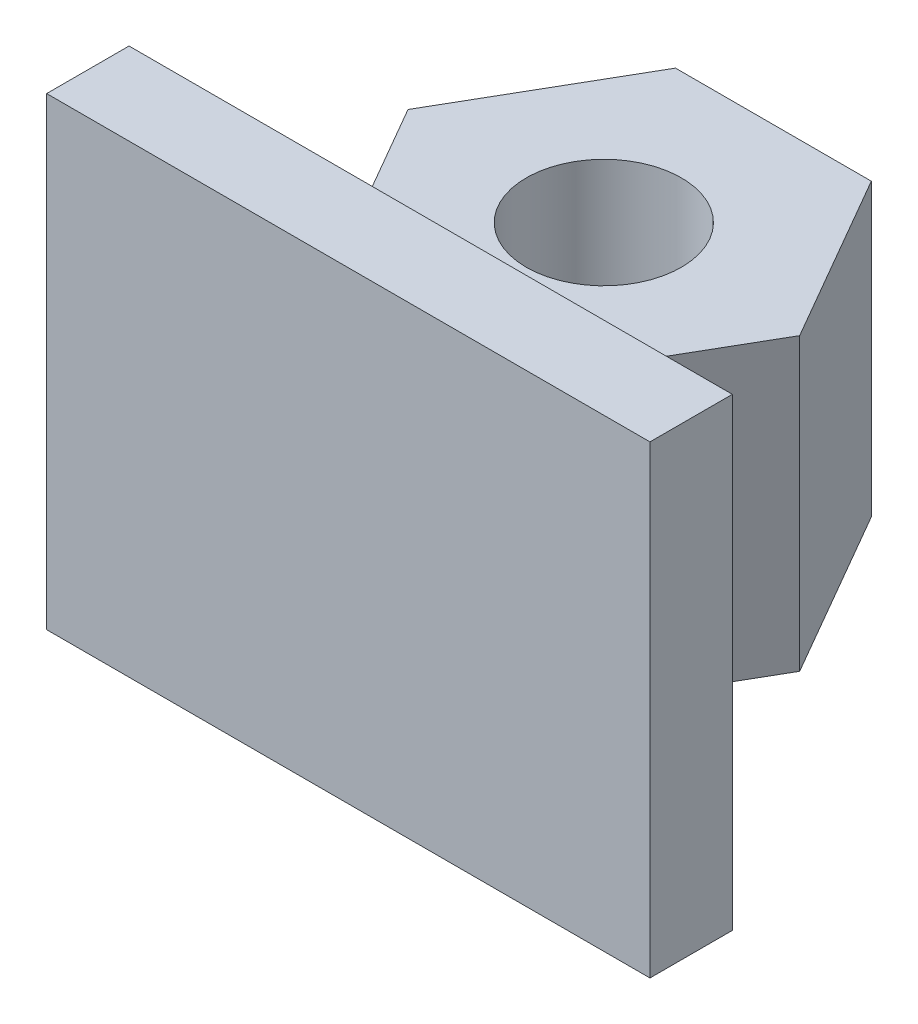
ISO-10303-21;
HEADER;
FILE_DESCRIPTION(('STEP AP214'),'2;1');
FILE_NAME('part.step','',(''),(''),'','','');
FILE_SCHEMA(('AUTOMOTIVE_DESIGN { 1 0 10303 214 1 1 1 1 }'));
ENDSEC;
DATA;
#1=APPLICATION_CONTEXT('core data for automotive mechanical design processes');
#2=APPLICATION_PROTOCOL_DEFINITION('international standard','automotive_design',2000,#1);
#3=PRODUCT_CONTEXT('',#1,'mechanical');
#4=PRODUCT('Part','Part','',(#3));
#5=PRODUCT_RELATED_PRODUCT_CATEGORY('part','',(#4));
#6=PRODUCT_DEFINITION_FORMATION('','',#4);
#7=PRODUCT_DEFINITION_CONTEXT('part definition',#1,'design');
#8=PRODUCT_DEFINITION('design','',#6,#7);
#9=PRODUCT_DEFINITION_SHAPE('','',#8);
#10=(LENGTH_UNIT() NAMED_UNIT(*) SI_UNIT(.MILLI.,.METRE.));
#11=(NAMED_UNIT(*) PLANE_ANGLE_UNIT() SI_UNIT($,.RADIAN.));
#12=(NAMED_UNIT(*) SI_UNIT($,.STERADIAN.) SOLID_ANGLE_UNIT());
#13=UNCERTAINTY_MEASURE_WITH_UNIT(LENGTH_MEASURE(1.E-05),#10,'distance_accuracy_value','');
#14=(GEOMETRIC_REPRESENTATION_CONTEXT(3) GLOBAL_UNCERTAINTY_ASSIGNED_CONTEXT((#13)) GLOBAL_UNIT_ASSIGNED_CONTEXT((#10,
#11,#12)) REPRESENTATION_CONTEXT('',''));
#15=CARTESIAN_POINT('',(0.,0.,0.));
#16=DIRECTION('',(0.,0.,1.));
#17=DIRECTION('',(1.,0.,0.));
#18=AXIS2_PLACEMENT_3D('',#15,#16,#17);
#19=CARTESIAN_POINT('',(0.,30.,0.));
#20=DIRECTION('',(0.,1.,0.));
#21=DIRECTION('',(0.,0.,1.));
#22=AXIS2_PLACEMENT_3D('',#19,#20,#21);
#23=PLANE('',#22);
#24=DIRECTION('',(0.5,0.,-0.866025403784439));
#25=VECTOR('',#24,1.);
#26=CARTESIAN_POINT('',(10.1036297108185,30.,17.5));
#27=LINE('',#26,#25);
#28=CARTESIAN_POINT('',(10.1036297108185,30.,17.5));
#29=VERTEX_POINT('',#28);
#30=CARTESIAN_POINT('',(20.2072594216369,30.,0.));
#31=VERTEX_POINT('',#30);
#32=EDGE_CURVE('E131',#29,#31,#27,.T.);
#33=ORIENTED_EDGE('',*,*,#32,.T.);
#34=DIRECTION('',(-0.5,0.,-0.866025403784439));
#35=VECTOR('',#34,1.);
#36=CARTESIAN_POINT('',(20.2072594216369,30.,0.));
#37=LINE('',#36,#35);
#38=CARTESIAN_POINT('',(10.1036297108184,30.,-17.5));
#39=VERTEX_POINT('',#38);
#40=EDGE_CURVE('E86',#31,#39,#37,.T.);
#41=ORIENTED_EDGE('',*,*,#40,.T.);
#42=DIRECTION('',(-1.,0.,0.));
#43=VECTOR('',#42,1.);
#44=CARTESIAN_POINT('',(10.1036297108184,30.,-17.5));
#45=LINE('',#44,#43);
#46=CARTESIAN_POINT('',(-10.1036297108185,30.,-17.5));
#47=VERTEX_POINT('',#46);
#48=EDGE_CURVE('E101',#39,#47,#45,.T.);
#49=ORIENTED_EDGE('',*,*,#48,.T.);
#50=DIRECTION('',(-0.5,0.,0.866025403784439));
#51=VECTOR('',#50,1.);
#52=CARTESIAN_POINT('',(-10.1036297108185,30.,-17.5));
#53=LINE('',#52,#51);
#54=CARTESIAN_POINT('',(-20.2072594216369,30.,0.));
#55=VERTEX_POINT('',#54);
#56=EDGE_CURVE('E95',#47,#55,#53,.T.);
#57=ORIENTED_EDGE('',*,*,#56,.T.);
#58=DIRECTION('',(0.5,0.,0.866025403784438));
#59=VECTOR('',#58,1.);
#60=CARTESIAN_POINT('',(-20.2072594216369,30.,0.));
#61=LINE('',#60,#59);
#62=CARTESIAN_POINT('',(-10.1036297108185,30.,17.5));
#63=VERTEX_POINT('',#62);
#64=EDGE_CURVE('E98',#55,#63,#61,.T.);
#65=ORIENTED_EDGE('',*,*,#64,.T.);
#66=DIRECTION('',(1.,0.,0.));
#67=VECTOR('',#66,1.);
#68=CARTESIAN_POINT('',(-10.1036297108185,30.,17.5));
#69=LINE('',#68,#67);
#70=EDGE_CURVE('E50',#63,#29,#69,.T.);
#71=ORIENTED_EDGE('',*,*,#70,.T.);
#72=EDGE_LOOP('',(#33,#41,#49,#57,#65,#71));
#73=FACE_BOUND('',#72,.T.);
#74=CARTESIAN_POINT('',(0.,30.,0.));
#75=DIRECTION('',(0.,1.,0.));
#76=DIRECTION('',(0.,0.,1.));
#77=AXIS2_PLACEMENT_3D('',#74,#75,#76);
#78=CIRCLE('',#77,8.);
#79=CARTESIAN_POINT('',(0.,30.,8.));
#80=VERTEX_POINT('',#79);
#81=EDGE_CURVE('E121',#80,#80,#78,.T.);
#82=ORIENTED_EDGE('',*,*,#81,.F.);
#83=EDGE_LOOP('',(#82));
#84=FACE_BOUND('',#83,.T.);
#85=ADVANCED_FACE('F33',(#73,#84),#23,.T.);
#86=CARTESIAN_POINT('',(0.,0.,0.));
#87=DIRECTION('',(0.,1.,0.));
#88=DIRECTION('',(0.,0.,1.));
#89=AXIS2_PLACEMENT_3D('',#86,#87,#88);
#90=PLANE('',#89);
#91=DIRECTION('',(0.5,0.,-0.866025403784439));
#92=VECTOR('',#91,1.);
#93=CARTESIAN_POINT('',(10.1036297108185,0.,17.5));
#94=LINE('',#93,#92);
#95=CARTESIAN_POINT('',(10.1036297108185,0.,17.5));
#96=VERTEX_POINT('',#95);
#97=CARTESIAN_POINT('',(20.2072594216369,0.,0.));
#98=VERTEX_POINT('',#97);
#99=EDGE_CURVE('E118',#96,#98,#94,.T.);
#100=ORIENTED_EDGE('',*,*,#99,.F.);
#101=DIRECTION('',(1.,0.,0.));
#102=VECTOR('',#101,1.);
#103=CARTESIAN_POINT('',(-10.1036297108185,0.,17.5));
#104=LINE('',#103,#102);
#105=CARTESIAN_POINT('',(-10.1036297108185,0.,17.5));
#106=VERTEX_POINT('',#105);
#107=EDGE_CURVE('E128',#106,#96,#104,.T.);
#108=ORIENTED_EDGE('',*,*,#107,.F.);
#109=DIRECTION('',(0.5,0.,0.866025403784438));
#110=VECTOR('',#109,1.);
#111=CARTESIAN_POINT('',(-20.2072594216369,0.,0.));
#112=LINE('',#111,#110);
#113=CARTESIAN_POINT('',(-20.2072594216369,0.,0.));
#114=VERTEX_POINT('',#113);
#115=EDGE_CURVE('E126',#114,#106,#112,.T.);
#116=ORIENTED_EDGE('',*,*,#115,.F.);
#117=DIRECTION('',(-0.5,0.,0.866025403784439));
#118=VECTOR('',#117,1.);
#119=CARTESIAN_POINT('',(-10.1036297108185,0.,-17.5));
#120=LINE('',#119,#118);
#121=CARTESIAN_POINT('',(-10.1036297108185,0.,-17.5));
#122=VERTEX_POINT('',#121);
#123=EDGE_CURVE('E71',#122,#114,#120,.T.);
#124=ORIENTED_EDGE('',*,*,#123,.F.);
#125=DIRECTION('',(-1.,0.,0.));
#126=VECTOR('',#125,1.);
#127=CARTESIAN_POINT('',(10.1036297108184,0.,-17.5));
#128=LINE('',#127,#126);
#129=CARTESIAN_POINT('',(10.1036297108184,0.,-17.5));
#130=VERTEX_POINT('',#129);
#131=EDGE_CURVE('E123',#130,#122,#128,.T.);
#132=ORIENTED_EDGE('',*,*,#131,.F.);
#133=DIRECTION('',(-0.5,0.,-0.866025403784439));
#134=VECTOR('',#133,1.);
#135=CARTESIAN_POINT('',(20.2072594216369,0.,0.));
#136=LINE('',#135,#134);
#137=EDGE_CURVE('E120',#98,#130,#136,.T.);
#138=ORIENTED_EDGE('',*,*,#137,.F.);
#139=EDGE_LOOP('',(#100,#108,#116,#124,#132,#138));
#140=FACE_BOUND('',#139,.T.);
#141=CARTESIAN_POINT('',(0.,0.,0.));
#142=DIRECTION('',(0.,1.,0.));
#143=DIRECTION('',(0.,0.,1.));
#144=AXIS2_PLACEMENT_3D('',#141,#142,#143);
#145=CIRCLE('',#144,8.);
#146=CARTESIAN_POINT('',(0.,0.,8.));
#147=VERTEX_POINT('',#146);
#148=EDGE_CURVE('E185',#147,#147,#145,.T.);
#149=ORIENTED_EDGE('',*,*,#148,.T.);
#150=EDGE_LOOP('',(#149));
#151=FACE_BOUND('',#150,.T.);
#152=ADVANCED_FACE('F139',(#140,#151),#90,.F.);
#153=CARTESIAN_POINT('',(10.1036297108185,30.,17.5));
#154=DIRECTION('',(-0.866025403784439,0.,-0.5));
#155=DIRECTION('',(-0.5,0.,0.866025403784439));
#156=AXIS2_PLACEMENT_3D('',#153,#154,#155);
#157=PLANE('',#156);
#158=ORIENTED_EDGE('',*,*,#99,.T.);
#159=DIRECTION('',(0.,-1.,0.));
#160=VECTOR('',#159,1.);
#161=CARTESIAN_POINT('',(20.2072594216369,30.,0.));
#162=LINE('',#161,#160);
#163=EDGE_CURVE('E11',#31,#98,#162,.T.);
#164=ORIENTED_EDGE('',*,*,#163,.F.);
#165=ORIENTED_EDGE('',*,*,#32,.F.);
#166=DIRECTION('',(0.,-1.,0.));
#167=VECTOR('',#166,1.);
#168=CARTESIAN_POINT('',(10.1036297108185,30.,17.5));
#169=LINE('',#168,#167);
#170=EDGE_CURVE('E78',#29,#96,#169,.T.);
#171=ORIENTED_EDGE('',*,*,#170,.T.);
#172=EDGE_LOOP('',(#158,#164,#165,#171));
#173=FACE_BOUND('',#172,.T.);
#174=ADVANCED_FACE('F35',(#173),#157,.F.);
#175=CARTESIAN_POINT('',(20.2072594216369,30.,0.));
#176=DIRECTION('',(-0.866025403784438,0.,0.5));
#177=DIRECTION('',(0.5,0.,0.866025403784439));
#178=AXIS2_PLACEMENT_3D('',#175,#176,#177);
#179=PLANE('',#178);
#180=ORIENTED_EDGE('',*,*,#137,.T.);
#181=DIRECTION('',(0.,-1.,0.));
#182=VECTOR('',#181,1.);
#183=CARTESIAN_POINT('',(10.1036297108184,30.,-17.5));
#184=LINE('',#183,#182);
#185=EDGE_CURVE('E42',#39,#130,#184,.T.);
#186=ORIENTED_EDGE('',*,*,#185,.F.);
#187=ORIENTED_EDGE('',*,*,#40,.F.);
#188=ORIENTED_EDGE('',*,*,#163,.T.);
#189=EDGE_LOOP('',(#180,#186,#187,#188));
#190=FACE_BOUND('',#189,.T.);
#191=ADVANCED_FACE('F175',(#190),#179,.F.);
#192=CARTESIAN_POINT('',(10.1036297108184,30.,-17.5));
#193=DIRECTION('',(0.,0.,1.));
#194=DIRECTION('',(1.,0.,0.));
#195=AXIS2_PLACEMENT_3D('',#192,#193,#194);
#196=PLANE('',#195);
#197=ORIENTED_EDGE('',*,*,#131,.T.);
#198=DIRECTION('',(0.,-1.,0.));
#199=VECTOR('',#198,1.);
#200=CARTESIAN_POINT('',(-10.1036297108185,30.,-17.5));
#201=LINE('',#200,#199);
#202=EDGE_CURVE('E109',#47,#122,#201,.T.);
#203=ORIENTED_EDGE('',*,*,#202,.F.);
#204=ORIENTED_EDGE('',*,*,#48,.F.);
#205=ORIENTED_EDGE('',*,*,#185,.T.);
#206=EDGE_LOOP('',(#197,#203,#204,#205));
#207=FACE_BOUND('',#206,.T.);
#208=ADVANCED_FACE('F137',(#207),#196,.F.);
#209=CARTESIAN_POINT('',(-10.1036297108185,30.,-17.5));
#210=DIRECTION('',(0.866025403784439,0.,0.5));
#211=DIRECTION('',(0.5,0.,-0.866025403784439));
#212=AXIS2_PLACEMENT_3D('',#209,#210,#211);
#213=PLANE('',#212);
#214=ORIENTED_EDGE('',*,*,#123,.T.);
#215=DIRECTION('',(0.,-1.,0.));
#216=VECTOR('',#215,1.);
#217=CARTESIAN_POINT('',(-20.2072594216369,30.,0.));
#218=LINE('',#217,#216);
#219=EDGE_CURVE('E104',#55,#114,#218,.T.);
#220=ORIENTED_EDGE('',*,*,#219,.F.);
#221=ORIENTED_EDGE('',*,*,#56,.F.);
#222=ORIENTED_EDGE('',*,*,#202,.T.);
#223=EDGE_LOOP('',(#214,#220,#221,#222));
#224=FACE_BOUND('',#223,.T.);
#225=ADVANCED_FACE('F105',(#224),#213,.F.);
#226=CARTESIAN_POINT('',(-20.2072594216369,30.,0.));
#227=DIRECTION('',(0.866025403784438,0.,-0.5));
#228=DIRECTION('',(-0.5,0.,-0.866025403784439));
#229=AXIS2_PLACEMENT_3D('',#226,#227,#228);
#230=PLANE('',#229);
#231=ORIENTED_EDGE('',*,*,#115,.T.);
#232=DIRECTION('',(0.,-1.,0.));
#233=VECTOR('',#232,1.);
#234=CARTESIAN_POINT('',(-10.1036297108185,30.,17.5));
#235=LINE('',#234,#233);
#236=EDGE_CURVE('E110',#63,#106,#235,.T.);
#237=ORIENTED_EDGE('',*,*,#236,.F.);
#238=ORIENTED_EDGE('',*,*,#64,.F.);
#239=ORIENTED_EDGE('',*,*,#219,.T.);
#240=EDGE_LOOP('',(#231,#237,#238,#239));
#241=FACE_BOUND('',#240,.T.);
#242=ADVANCED_FACE('F112',(#241),#230,.F.);
#243=CARTESIAN_POINT('',(0.,30.,0.));
#244=DIRECTION('',(0.,-1.,0.));
#245=DIRECTION('',(0.,0.,-1.));
#246=AXIS2_PLACEMENT_3D('',#243,#244,#245);
#247=CYLINDRICAL_SURFACE('',#246,8.);
#248=ORIENTED_EDGE('',*,*,#81,.T.);
#249=EDGE_LOOP('',(#248));
#250=FACE_BOUND('',#249,.T.);
#251=ORIENTED_EDGE('',*,*,#148,.F.);
#252=EDGE_LOOP('',(#251));
#253=FACE_BOUND('',#252,.T.);
#254=ADVANCED_FACE('F147',(#250,#253),#247,.F.);
#255=CARTESIAN_POINT('',(0.,0.,17.5));
#256=DIRECTION('',(0.,0.,1.));
#257=DIRECTION('',(1.,0.,0.));
#258=AXIS2_PLACEMENT_3D('',#255,#256,#257);
#259=PLANE('',#258);
#260=DIRECTION('',(0.,-1.,0.));
#261=VECTOR('',#260,1.);
#262=CARTESIAN_POINT('',(-31.4935077023558,38.7809108338269,17.5));
#263=LINE('',#262,#261);
#264=CARTESIAN_POINT('',(-31.4935077023558,38.7809108338269,17.5));
#265=VERTEX_POINT('',#264);
#266=CARTESIAN_POINT('',(-31.4935077023558,-9.12930291666201,17.5));
#267=VERTEX_POINT('',#266);
#268=EDGE_CURVE('E213',#265,#267,#263,.T.);
#269=ORIENTED_EDGE('',*,*,#268,.F.);
#270=DIRECTION('',(-1.,0.,0.));
#271=VECTOR('',#270,1.);
#272=CARTESIAN_POINT('',(-31.4935077023558,38.7809108338269,17.5));
#273=LINE('',#272,#271);
#274=CARTESIAN_POINT('',(30.7601959672609,38.7809108338269,17.5));
#275=VERTEX_POINT('',#274);
#276=EDGE_CURVE('E203',#275,#265,#273,.T.);
#277=ORIENTED_EDGE('',*,*,#276,.F.);
#278=DIRECTION('',(0.,1.,0.));
#279=VECTOR('',#278,1.);
#280=CARTESIAN_POINT('',(30.7601959672609,38.7809108338269,17.5));
#281=LINE('',#280,#279);
#282=CARTESIAN_POINT('',(30.7601959672609,-9.12930291666201,17.5));
#283=VERTEX_POINT('',#282);
#284=EDGE_CURVE('E207',#283,#275,#281,.T.);
#285=ORIENTED_EDGE('',*,*,#284,.F.);
#286=DIRECTION('',(1.,0.,0.));
#287=VECTOR('',#286,1.);
#288=CARTESIAN_POINT('',(-31.4935077023558,-9.12930291666201,17.5));
#289=LINE('',#288,#287);
#290=EDGE_CURVE('E210',#267,#283,#289,.T.);
#291=ORIENTED_EDGE('',*,*,#290,.F.);
#292=EDGE_LOOP('',(#269,#277,#285,#291));
#293=FACE_BOUND('',#292,.T.);
#294=ORIENTED_EDGE('',*,*,#107,.T.);
#295=ORIENTED_EDGE('',*,*,#170,.F.);
#296=ORIENTED_EDGE('',*,*,#70,.F.);
#297=ORIENTED_EDGE('',*,*,#236,.T.);
#298=EDGE_LOOP('',(#294,#295,#296,#297));
#299=FACE_BOUND('',#298,.T.);
#300=ADVANCED_FACE('F144',(#293,#299),#259,.F.);
#301=CARTESIAN_POINT('',(-31.4935077023558,38.7809108338269,26.));
#302=DIRECTION('',(1.,0.,0.));
#303=DIRECTION('',(0.,0.,-1.));
#304=AXIS2_PLACEMENT_3D('',#301,#302,#303);
#305=PLANE('',#304);
#306=ORIENTED_EDGE('',*,*,#268,.T.);
#307=DIRECTION('',(0.,0.,-1.));
#308=VECTOR('',#307,1.);
#309=CARTESIAN_POINT('',(-31.4935077023558,-9.12930291666201,26.));
#310=LINE('',#309,#308);
#311=CARTESIAN_POINT('',(-31.4935077023558,-9.12930291666201,26.));
#312=VERTEX_POINT('',#311);
#313=EDGE_CURVE('E188',#312,#267,#310,.T.);
#314=ORIENTED_EDGE('',*,*,#313,.F.);
#315=DIRECTION('',(0.,-1.,0.));
#316=VECTOR('',#315,1.);
#317=CARTESIAN_POINT('',(-31.4935077023558,38.7809108338269,26.));
#318=LINE('',#317,#316);
#319=CARTESIAN_POINT('',(-31.4935077023558,38.7809108338269,26.));
#320=VERTEX_POINT('',#319);
#321=EDGE_CURVE('E206',#320,#312,#318,.T.);
#322=ORIENTED_EDGE('',*,*,#321,.F.);
#323=DIRECTION('',(0.,0.,-1.));
#324=VECTOR('',#323,1.);
#325=CARTESIAN_POINT('',(-31.4935077023558,38.7809108338269,26.));
#326=LINE('',#325,#324);
#327=EDGE_CURVE('E199',#320,#265,#326,.T.);
#328=ORIENTED_EDGE('',*,*,#327,.T.);
#329=EDGE_LOOP('',(#306,#314,#322,#328));
#330=FACE_BOUND('',#329,.T.);
#331=ADVANCED_FACE('F146',(#330),#305,.F.);
#332=CARTESIAN_POINT('',(-31.4935077023558,-9.12930291666201,26.));
#333=DIRECTION('',(0.,1.,0.));
#334=DIRECTION('',(0.,0.,1.));
#335=AXIS2_PLACEMENT_3D('',#332,#333,#334);
#336=PLANE('',#335);
#337=ORIENTED_EDGE('',*,*,#290,.T.);
#338=DIRECTION('',(0.,0.,-1.));
#339=VECTOR('',#338,1.);
#340=CARTESIAN_POINT('',(30.7601959672609,-9.12930291666201,26.));
#341=LINE('',#340,#339);
#342=CARTESIAN_POINT('',(30.7601959672609,-9.12930291666201,26.));
#343=VERTEX_POINT('',#342);
#344=EDGE_CURVE('E193',#343,#283,#341,.T.);
#345=ORIENTED_EDGE('',*,*,#344,.F.);
#346=DIRECTION('',(1.,0.,0.));
#347=VECTOR('',#346,1.);
#348=CARTESIAN_POINT('',(-31.4935077023558,-9.12930291666201,26.));
#349=LINE('',#348,#347);
#350=EDGE_CURVE('E221',#312,#343,#349,.T.);
#351=ORIENTED_EDGE('',*,*,#350,.F.);
#352=ORIENTED_EDGE('',*,*,#313,.T.);
#353=EDGE_LOOP('',(#337,#345,#351,#352));
#354=FACE_BOUND('',#353,.T.);
#355=ADVANCED_FACE('F154',(#354),#336,.F.);
#356=CARTESIAN_POINT('',(30.7601959672609,38.7809108338269,26.));
#357=DIRECTION('',(-1.,0.,0.));
#358=DIRECTION('',(0.,0.,1.));
#359=AXIS2_PLACEMENT_3D('',#356,#357,#358);
#360=PLANE('',#359);
#361=ORIENTED_EDGE('',*,*,#284,.T.);
#362=DIRECTION('',(0.,0.,-1.));
#363=VECTOR('',#362,1.);
#364=CARTESIAN_POINT('',(30.7601959672609,38.7809108338269,26.));
#365=LINE('',#364,#363);
#366=CARTESIAN_POINT('',(30.7601959672609,38.7809108338269,26.));
#367=VERTEX_POINT('',#366);
#368=EDGE_CURVE('E196',#367,#275,#365,.T.);
#369=ORIENTED_EDGE('',*,*,#368,.F.);
#370=DIRECTION('',(0.,1.,0.));
#371=VECTOR('',#370,1.);
#372=CARTESIAN_POINT('',(30.7601959672609,38.7809108338269,26.));
#373=LINE('',#372,#371);
#374=EDGE_CURVE('E218',#343,#367,#373,.T.);
#375=ORIENTED_EDGE('',*,*,#374,.F.);
#376=ORIENTED_EDGE('',*,*,#344,.T.);
#377=EDGE_LOOP('',(#361,#369,#375,#376));
#378=FACE_BOUND('',#377,.T.);
#379=ADVANCED_FACE('F253',(#378),#360,.F.);
#380=CARTESIAN_POINT('',(-31.4935077023558,38.7809108338269,26.));
#381=DIRECTION('',(0.,-1.,0.));
#382=DIRECTION('',(0.,0.,-1.));
#383=AXIS2_PLACEMENT_3D('',#380,#381,#382);
#384=PLANE('',#383);
#385=ORIENTED_EDGE('',*,*,#276,.T.);
#386=ORIENTED_EDGE('',*,*,#327,.F.);
#387=DIRECTION('',(-1.,0.,0.));
#388=VECTOR('',#387,1.);
#389=CARTESIAN_POINT('',(-31.4935077023558,38.7809108338269,26.));
#390=LINE('',#389,#388);
#391=EDGE_CURVE('E202',#367,#320,#390,.T.);
#392=ORIENTED_EDGE('',*,*,#391,.F.);
#393=ORIENTED_EDGE('',*,*,#368,.T.);
#394=EDGE_LOOP('',(#385,#386,#392,#393));
#395=FACE_BOUND('',#394,.T.);
#396=ADVANCED_FACE('F250',(#395),#384,.F.);
#397=CARTESIAN_POINT('',(0.,0.,26.));
#398=DIRECTION('',(0.,0.,1.));
#399=DIRECTION('',(1.,0.,0.));
#400=AXIS2_PLACEMENT_3D('',#397,#398,#399);
#401=PLANE('',#400);
#402=ORIENTED_EDGE('',*,*,#321,.T.);
#403=ORIENTED_EDGE('',*,*,#350,.T.);
#404=ORIENTED_EDGE('',*,*,#374,.T.);
#405=ORIENTED_EDGE('',*,*,#391,.T.);
#406=EDGE_LOOP('',(#402,#403,#404,#405));
#407=FACE_BOUND('',#406,.T.);
#408=ADVANCED_FACE('F229',(#407),#401,.T.);
#409=CLOSED_SHELL('',(#85,#152,#174,#191,#208,#225,#242,#254,#300,#331,#355,#379,#396,#408));
#410=MANIFOLD_SOLID_BREP('B2',#409);
#411=ADVANCED_BREP_SHAPE_REPRESENTATION('',(#18,#410),#14);
#412=SHAPE_DEFINITION_REPRESENTATION(#9,#411);
ENDSEC;
END-ISO-10303-21;
